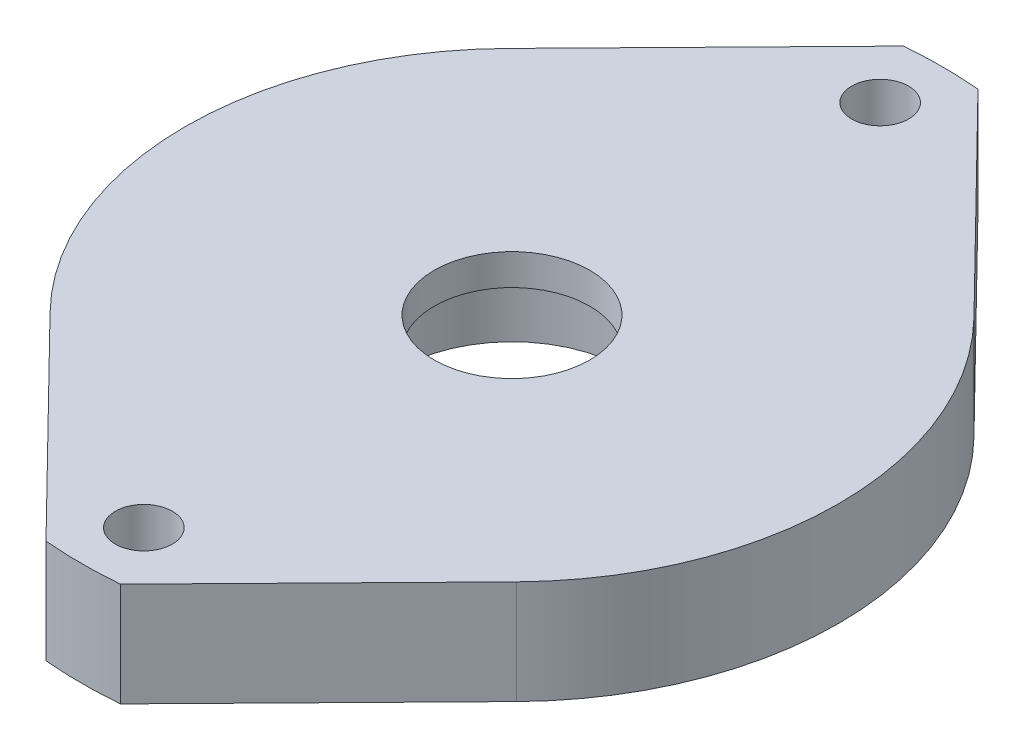
ISO-10303-21;
HEADER;
FILE_DESCRIPTION(('STEP AP214'),'2;1');
FILE_NAME('part.step','',(''),(''),'','','');
FILE_SCHEMA(('AUTOMOTIVE_DESIGN { 1 0 10303 214 1 1 1 1 }'));
ENDSEC;
DATA;
#1=APPLICATION_CONTEXT('core data for automotive mechanical design processes');
#2=APPLICATION_PROTOCOL_DEFINITION('international standard','automotive_design',2000,#1);
#3=PRODUCT_CONTEXT('',#1,'mechanical');
#4=PRODUCT('Part','Part','',(#3));
#5=PRODUCT_RELATED_PRODUCT_CATEGORY('part','',(#4));
#6=PRODUCT_DEFINITION_FORMATION('','',#4);
#7=PRODUCT_DEFINITION_CONTEXT('part definition',#1,'design');
#8=PRODUCT_DEFINITION('design','',#6,#7);
#9=PRODUCT_DEFINITION_SHAPE('','',#8);
#10=(LENGTH_UNIT() NAMED_UNIT(*) SI_UNIT(.MILLI.,.METRE.));
#11=(NAMED_UNIT(*) PLANE_ANGLE_UNIT() SI_UNIT($,.RADIAN.));
#12=(NAMED_UNIT(*) SI_UNIT($,.STERADIAN.) SOLID_ANGLE_UNIT());
#13=UNCERTAINTY_MEASURE_WITH_UNIT(LENGTH_MEASURE(1.E-05),#10,'distance_accuracy_value','');
#14=(GEOMETRIC_REPRESENTATION_CONTEXT(3) GLOBAL_UNCERTAINTY_ASSIGNED_CONTEXT((#13)) GLOBAL_UNIT_ASSIGNED_CONTEXT((#10,
#11,#12)) REPRESENTATION_CONTEXT('',''));
#15=CARTESIAN_POINT('',(0.,0.,0.));
#16=DIRECTION('',(0.,0.,1.));
#17=DIRECTION('',(1.,0.,0.));
#18=AXIS2_PLACEMENT_3D('',#15,#16,#17);
#19=CARTESIAN_POINT('',(0.,0.,0.));
#20=DIRECTION('',(0.,1.,0.));
#21=DIRECTION('',(0.,0.,1.));
#22=AXIS2_PLACEMENT_3D('',#19,#20,#21);
#23=PLANE('',#22);
#24=CARTESIAN_POINT('',(0.,0.,-35.5));
#25=DIRECTION('',(0.,-1.,0.));
#26=DIRECTION('',(0.,0.,-1.));
#27=AXIS2_PLACEMENT_3D('',#24,#25,#26);
#28=CIRCLE('',#27,2.74999999999999);
#29=CARTESIAN_POINT('',(0.,0.,-38.25));
#30=VERTEX_POINT('',#29);
#31=EDGE_CURVE('E237',#30,#30,#28,.T.);
#32=ORIENTED_EDGE('',*,*,#31,.F.);
#33=EDGE_LOOP('',(#32));
#34=FACE_BOUND('',#33,.T.);
#35=CARTESIAN_POINT('',(0.,0.,35.5));
#36=DIRECTION('',(0.,-1.,0.));
#37=DIRECTION('',(0.,0.,-1.));
#38=AXIS2_PLACEMENT_3D('',#35,#36,#37);
#39=CIRCLE('',#38,2.74999999999999);
#40=CARTESIAN_POINT('',(0.,0.,32.75));
#41=VERTEX_POINT('',#40);
#42=EDGE_CURVE('E239',#41,#41,#39,.T.);
#43=ORIENTED_EDGE('',*,*,#42,.F.);
#44=EDGE_LOOP('',(#43));
#45=FACE_BOUND('',#44,.T.);
#46=DIRECTION('',(-0.699854212223765,0.,0.714285714285714));
#47=VECTOR('',#46,1.);
#48=CARTESIAN_POINT('',(22.5,0.,22.0454076850486));
#49=LINE('',#48,#47);
#50=CARTESIAN_POINT('',(22.5,0.,22.0454076850486));
#51=VERTEX_POINT('',#50);
#52=CARTESIAN_POINT('',(3.59098044825795,0.,41.3443449509147));
#53=VERTEX_POINT('',#52);
#54=EDGE_CURVE('E145',#51,#53,#49,.T.);
#55=ORIENTED_EDGE('',*,*,#54,.T.);
#56=CARTESIAN_POINT('',(0.,0.,0.));
#57=DIRECTION('',(0.,1.,0.));
#58=DIRECTION('',(0.,0.,1.));
#59=AXIS2_PLACEMENT_3D('',#56,#57,#58);
#60=CIRCLE('',#59,41.5);
#61=CARTESIAN_POINT('',(-3.59098044825795,0.,41.3443449509147));
#62=VERTEX_POINT('',#61);
#63=EDGE_CURVE('E41',#62,#53,#60,.T.);
#64=ORIENTED_EDGE('',*,*,#63,.F.);
#65=DIRECTION('',(-0.699854212223765,0.,-0.714285714285714));
#66=VECTOR('',#65,1.);
#67=CARTESIAN_POINT('',(-22.5,0.,22.0454076850486));
#68=LINE('',#67,#66);
#69=CARTESIAN_POINT('',(-22.5,0.,22.0454076850486));
#70=VERTEX_POINT('',#69);
#71=EDGE_CURVE('E119',#62,#70,#68,.T.);
#72=ORIENTED_EDGE('',*,*,#71,.T.);
#73=CARTESIAN_POINT('',(0.,0.,0.));
#74=DIRECTION('',(0.,-1.,0.));
#75=DIRECTION('',(0.,0.,-1.));
#76=AXIS2_PLACEMENT_3D('',#73,#74,#75);
#77=CIRCLE('',#76,31.5);
#78=CARTESIAN_POINT('',(-22.5,0.,-22.0454076850486));
#79=VERTEX_POINT('',#78);
#80=EDGE_CURVE('E137',#70,#79,#77,.T.);
#81=ORIENTED_EDGE('',*,*,#80,.T.);
#82=DIRECTION('',(0.699854212223765,0.,-0.714285714285714));
#83=VECTOR('',#82,1.);
#84=CARTESIAN_POINT('',(-22.5,0.,-22.0454076850486));
#85=LINE('',#84,#83);
#86=CARTESIAN_POINT('',(-3.59098044825794,0.,-41.3443449509147));
#87=VERTEX_POINT('',#86);
#88=EDGE_CURVE('E106',#79,#87,#85,.T.);
#89=ORIENTED_EDGE('',*,*,#88,.T.);
#90=CARTESIAN_POINT('',(3.59098044825795,0.,-41.3443449509147));
#91=VERTEX_POINT('',#90);
#92=EDGE_CURVE('E163',#91,#87,#60,.T.);
#93=ORIENTED_EDGE('',*,*,#92,.F.);
#94=DIRECTION('',(0.699854212223765,0.,0.714285714285714));
#95=VECTOR('',#94,1.);
#96=CARTESIAN_POINT('',(22.5,0.,-22.0454076850486));
#97=LINE('',#96,#95);
#98=CARTESIAN_POINT('',(22.5,0.,-22.0454076850486));
#99=VERTEX_POINT('',#98);
#100=EDGE_CURVE('E141',#91,#99,#97,.T.);
#101=ORIENTED_EDGE('',*,*,#100,.T.);
#102=CARTESIAN_POINT('',(0.,0.,0.));
#103=DIRECTION('',(0.,-1.,0.));
#104=DIRECTION('',(0.,0.,-1.));
#105=AXIS2_PLACEMENT_3D('',#102,#103,#104);
#106=CIRCLE('',#105,31.5);
#107=EDGE_CURVE('E53',#99,#51,#106,.T.);
#108=ORIENTED_EDGE('',*,*,#107,.T.);
#109=EDGE_LOOP('',(#55,#64,#72,#81,#89,#93,#101,#108));
#110=FACE_BOUND('',#109,.T.);
#111=CARTESIAN_POINT('',(0.,0.,0.));
#112=DIRECTION('',(0.,1.,0.));
#113=DIRECTION('',(0.,0.,1.));
#114=AXIS2_PLACEMENT_3D('',#111,#112,#113);
#115=CIRCLE('',#114,11.);
#116=CARTESIAN_POINT('',(0.,0.,11.));
#117=VERTEX_POINT('',#116);
#118=EDGE_CURVE('E251',#117,#117,#115,.T.);
#119=ORIENTED_EDGE('',*,*,#118,.T.);
#120=EDGE_LOOP('',(#119));
#121=FACE_BOUND('',#120,.T.);
#122=ADVANCED_FACE('F37',(#34,#45,#110,#121),#23,.F.);
#123=CARTESIAN_POINT('',(0.,10.,0.));
#124=DIRECTION('',(0.,-1.,0.));
#125=DIRECTION('',(0.,0.,-1.));
#126=AXIS2_PLACEMENT_3D('',#123,#124,#125);
#127=CYLINDRICAL_SURFACE('',#126,41.5);
#128=DIRECTION('',(0.,-1.,0.));
#129=VECTOR('',#128,1.);
#130=CARTESIAN_POINT('',(-3.59098044825795,10.,41.3443449509147));
#131=LINE('',#130,#129);
#132=CARTESIAN_POINT('',(-3.59098044825795,10.,41.3443449509147));
#133=VERTEX_POINT('',#132);
#134=EDGE_CURVE('E151',#133,#62,#131,.T.);
#135=ORIENTED_EDGE('',*,*,#134,.T.);
#136=ORIENTED_EDGE('',*,*,#63,.T.);
#137=DIRECTION('',(0.,-1.,0.));
#138=VECTOR('',#137,1.);
#139=CARTESIAN_POINT('',(3.59098044825795,10.,41.3443449509147));
#140=LINE('',#139,#138);
#141=CARTESIAN_POINT('',(3.59098044825795,10.,41.3443449509147));
#142=VERTEX_POINT('',#141);
#143=EDGE_CURVE('E154',#142,#53,#140,.T.);
#144=ORIENTED_EDGE('',*,*,#143,.F.);
#145=CARTESIAN_POINT('',(0.,10.,0.));
#146=DIRECTION('',(0.,1.,0.));
#147=DIRECTION('',(0.,0.,1.));
#148=AXIS2_PLACEMENT_3D('',#145,#146,#147);
#149=CIRCLE('',#148,41.5);
#150=EDGE_CURVE('E46',#133,#142,#149,.T.);
#151=ORIENTED_EDGE('',*,*,#150,.F.);
#152=EDGE_LOOP('',(#135,#136,#144,#151));
#153=FACE_BOUND('',#152,.T.);
#154=ADVANCED_FACE('F39',(#153),#127,.T.);
#155=DIRECTION('',(0.,-1.,0.));
#156=VECTOR('',#155,1.);
#157=CARTESIAN_POINT('',(3.59098044825795,10.,-41.3443449509147));
#158=LINE('',#157,#156);
#159=CARTESIAN_POINT('',(3.59098044825795,10.,-41.3443449509147));
#160=VERTEX_POINT('',#159);
#161=EDGE_CURVE('E160',#160,#91,#158,.T.);
#162=ORIENTED_EDGE('',*,*,#161,.T.);
#163=ORIENTED_EDGE('',*,*,#92,.T.);
#164=DIRECTION('',(0.,-1.,0.));
#165=VECTOR('',#164,1.);
#166=CARTESIAN_POINT('',(-3.59098044825794,10.,-41.3443449509147));
#167=LINE('',#166,#165);
#168=CARTESIAN_POINT('',(-3.59098044825795,10.,-41.3443449509147));
#169=VERTEX_POINT('',#168);
#170=EDGE_CURVE('E61',#169,#87,#167,.T.);
#171=ORIENTED_EDGE('',*,*,#170,.F.);
#172=EDGE_CURVE('E12',#160,#169,#149,.T.);
#173=ORIENTED_EDGE('',*,*,#172,.F.);
#174=EDGE_LOOP('',(#162,#163,#171,#173));
#175=FACE_BOUND('',#174,.T.);
#176=ADVANCED_FACE('F182',(#175),#127,.T.);
#177=CARTESIAN_POINT('',(0.,10.,0.));
#178=DIRECTION('',(0.,1.,0.));
#179=DIRECTION('',(0.,0.,1.));
#180=AXIS2_PLACEMENT_3D('',#177,#178,#179);
#181=PLANE('',#180);
#182=CARTESIAN_POINT('',(0.,10.,-35.5));
#183=DIRECTION('',(0.,-1.,0.));
#184=DIRECTION('',(0.,0.,-1.));
#185=AXIS2_PLACEMENT_3D('',#182,#183,#184);
#186=CIRCLE('',#185,2.75);
#187=CARTESIAN_POINT('',(0.,10.,-38.25));
#188=VERTEX_POINT('',#187);
#189=EDGE_CURVE('E235',#188,#188,#186,.T.);
#190=ORIENTED_EDGE('',*,*,#189,.T.);
#191=EDGE_LOOP('',(#190));
#192=FACE_BOUND('',#191,.T.);
#193=CARTESIAN_POINT('',(0.,10.,35.5));
#194=DIRECTION('',(0.,-1.,0.));
#195=DIRECTION('',(0.,0.,-1.));
#196=AXIS2_PLACEMENT_3D('',#193,#194,#195);
#197=CIRCLE('',#196,2.75);
#198=CARTESIAN_POINT('',(0.,10.,32.75));
#199=VERTEX_POINT('',#198);
#200=EDGE_CURVE('E244',#199,#199,#197,.T.);
#201=ORIENTED_EDGE('',*,*,#200,.T.);
#202=EDGE_LOOP('',(#201));
#203=FACE_BOUND('',#202,.T.);
#204=CARTESIAN_POINT('',(0.,10.,0.));
#205=DIRECTION('',(0.,1.,0.));
#206=DIRECTION('',(0.,0.,1.));
#207=AXIS2_PLACEMENT_3D('',#204,#205,#206);
#208=CIRCLE('',#207,7.5);
#209=CARTESIAN_POINT('',(0.,10.,7.5));
#210=VERTEX_POINT('',#209);
#211=EDGE_CURVE('E247',#210,#210,#208,.F.);
#212=ORIENTED_EDGE('',*,*,#211,.T.);
#213=EDGE_LOOP('',(#212));
#214=FACE_BOUND('',#213,.T.);
#215=ORIENTED_EDGE('',*,*,#150,.T.);
#216=DIRECTION('',(-0.699854212223765,0.,0.714285714285714));
#217=VECTOR('',#216,1.);
#218=CARTESIAN_POINT('',(22.5,10.,22.0454076850486));
#219=LINE('',#218,#217);
#220=CARTESIAN_POINT('',(22.5,10.,22.0454076850486));
#221=VERTEX_POINT('',#220);
#222=EDGE_CURVE('E134',#221,#142,#219,.T.);
#223=ORIENTED_EDGE('',*,*,#222,.F.);
#224=CARTESIAN_POINT('',(0.,10.,0.));
#225=DIRECTION('',(0.,-1.,0.));
#226=DIRECTION('',(0.,0.,-1.));
#227=AXIS2_PLACEMENT_3D('',#224,#225,#226);
#228=CIRCLE('',#227,31.5);
#229=CARTESIAN_POINT('',(22.5,10.,-22.0454076850486));
#230=VERTEX_POINT('',#229);
#231=EDGE_CURVE('E128',#230,#221,#228,.T.);
#232=ORIENTED_EDGE('',*,*,#231,.F.);
#233=DIRECTION('',(0.699854212223765,0.,0.714285714285714));
#234=VECTOR('',#233,1.);
#235=CARTESIAN_POINT('',(22.5,10.,-22.0454076850486));
#236=LINE('',#235,#234);
#237=EDGE_CURVE('E125',#160,#230,#236,.T.);
#238=ORIENTED_EDGE('',*,*,#237,.F.);
#239=ORIENTED_EDGE('',*,*,#172,.T.);
#240=DIRECTION('',(0.699854212223765,0.,-0.714285714285714));
#241=VECTOR('',#240,1.);
#242=CARTESIAN_POINT('',(-22.5,10.,-22.0454076850486));
#243=LINE('',#242,#241);
#244=CARTESIAN_POINT('',(-22.5,10.,-22.0454076850486));
#245=VERTEX_POINT('',#244);
#246=EDGE_CURVE('E105',#245,#169,#243,.T.);
#247=ORIENTED_EDGE('',*,*,#246,.F.);
#248=CARTESIAN_POINT('',(0.,10.,0.));
#249=DIRECTION('',(0.,-1.,0.));
#250=DIRECTION('',(0.,0.,-1.));
#251=AXIS2_PLACEMENT_3D('',#248,#249,#250);
#252=CIRCLE('',#251,31.5);
#253=CARTESIAN_POINT('',(-22.5,10.,22.0454076850486));
#254=VERTEX_POINT('',#253);
#255=EDGE_CURVE('E113',#254,#245,#252,.T.);
#256=ORIENTED_EDGE('',*,*,#255,.F.);
#257=DIRECTION('',(-0.699854212223765,0.,-0.714285714285714));
#258=VECTOR('',#257,1.);
#259=CARTESIAN_POINT('',(-22.5,10.,22.0454076850486));
#260=LINE('',#259,#258);
#261=EDGE_CURVE('E110',#133,#254,#260,.T.);
#262=ORIENTED_EDGE('',*,*,#261,.F.);
#263=EDGE_LOOP('',(#215,#223,#232,#238,#239,#247,#256,#262));
#264=FACE_BOUND('',#263,.T.);
#265=ADVANCED_FACE('F122',(#192,#203,#214,#264),#181,.T.);
#266=CARTESIAN_POINT('',(-22.5,10.,22.0454076850486));
#267=DIRECTION('',(-0.714285714285714,0.,0.699854212223765));
#268=DIRECTION('',(0.699854212223765,0.,0.714285714285714));
#269=AXIS2_PLACEMENT_3D('',#266,#267,#268);
#270=PLANE('',#269);
#271=ORIENTED_EDGE('',*,*,#71,.F.);
#272=ORIENTED_EDGE('',*,*,#134,.F.);
#273=ORIENTED_EDGE('',*,*,#261,.T.);
#274=DIRECTION('',(0.,-1.,0.));
#275=VECTOR('',#274,1.);
#276=CARTESIAN_POINT('',(-22.5,10.,22.0454076850486));
#277=LINE('',#276,#275);
#278=EDGE_CURVE('E115',#254,#70,#277,.T.);
#279=ORIENTED_EDGE('',*,*,#278,.T.);
#280=EDGE_LOOP('',(#271,#272,#273,#279));
#281=FACE_BOUND('',#280,.T.);
#282=ADVANCED_FACE('F188',(#281),#270,.T.);
#283=CARTESIAN_POINT('',(-22.5,10.,-22.0454076850486));
#284=DIRECTION('',(-0.714285714285714,0.,-0.699854212223765));
#285=DIRECTION('',(-0.699854212223765,0.,0.714285714285714));
#286=AXIS2_PLACEMENT_3D('',#283,#284,#285);
#287=PLANE('',#286);
#288=ORIENTED_EDGE('',*,*,#88,.F.);
#289=DIRECTION('',(0.,-1.,0.));
#290=VECTOR('',#289,1.);
#291=CARTESIAN_POINT('',(-22.5,10.,-22.0454076850486));
#292=LINE('',#291,#290);
#293=EDGE_CURVE('E101',#245,#79,#292,.T.);
#294=ORIENTED_EDGE('',*,*,#293,.F.);
#295=ORIENTED_EDGE('',*,*,#246,.T.);
#296=ORIENTED_EDGE('',*,*,#170,.T.);
#297=EDGE_LOOP('',(#288,#294,#295,#296));
#298=FACE_BOUND('',#297,.T.);
#299=ADVANCED_FACE('F103',(#298),#287,.T.);
#300=CARTESIAN_POINT('',(0.,10.,0.));
#301=DIRECTION('',(0.,-1.,0.));
#302=DIRECTION('',(0.,0.,-1.));
#303=AXIS2_PLACEMENT_3D('',#300,#301,#302);
#304=CYLINDRICAL_SURFACE('',#303,31.5);
#305=ORIENTED_EDGE('',*,*,#80,.F.);
#306=ORIENTED_EDGE('',*,*,#278,.F.);
#307=ORIENTED_EDGE('',*,*,#255,.T.);
#308=ORIENTED_EDGE('',*,*,#293,.T.);
#309=EDGE_LOOP('',(#305,#306,#307,#308));
#310=FACE_BOUND('',#309,.T.);
#311=ADVANCED_FACE('F114',(#310),#304,.T.);
#312=CARTESIAN_POINT('',(22.5,10.,22.0454076850486));
#313=DIRECTION('',(0.714285714285714,0.,0.699854212223765));
#314=DIRECTION('',(0.699854212223765,0.,-0.714285714285714));
#315=AXIS2_PLACEMENT_3D('',#312,#313,#314);
#316=PLANE('',#315);
#317=ORIENTED_EDGE('',*,*,#54,.F.);
#318=DIRECTION('',(0.,-1.,0.));
#319=VECTOR('',#318,1.);
#320=CARTESIAN_POINT('',(22.5,10.,22.0454076850486));
#321=LINE('',#320,#319);
#322=EDGE_CURVE('E156',#221,#51,#321,.T.);
#323=ORIENTED_EDGE('',*,*,#322,.F.);
#324=ORIENTED_EDGE('',*,*,#222,.T.);
#325=ORIENTED_EDGE('',*,*,#143,.T.);
#326=EDGE_LOOP('',(#317,#323,#324,#325));
#327=FACE_BOUND('',#326,.T.);
#328=ADVANCED_FACE('F177',(#327),#316,.T.);
#329=CARTESIAN_POINT('',(0.,10.,0.));
#330=DIRECTION('',(0.,-1.,0.));
#331=DIRECTION('',(0.,0.,-1.));
#332=AXIS2_PLACEMENT_3D('',#329,#330,#331);
#333=CYLINDRICAL_SURFACE('',#332,31.5);
#334=ORIENTED_EDGE('',*,*,#107,.F.);
#335=DIRECTION('',(0.,-1.,0.));
#336=VECTOR('',#335,1.);
#337=CARTESIAN_POINT('',(22.5,10.,-22.0454076850486));
#338=LINE('',#337,#336);
#339=EDGE_CURVE('E158',#230,#99,#338,.T.);
#340=ORIENTED_EDGE('',*,*,#339,.F.);
#341=ORIENTED_EDGE('',*,*,#231,.T.);
#342=ORIENTED_EDGE('',*,*,#322,.T.);
#343=EDGE_LOOP('',(#334,#340,#341,#342));
#344=FACE_BOUND('',#343,.T.);
#345=ADVANCED_FACE('F179',(#344),#333,.T.);
#346=CARTESIAN_POINT('',(22.5,10.,-22.0454076850486));
#347=DIRECTION('',(0.714285714285714,0.,-0.699854212223765));
#348=DIRECTION('',(-0.699854212223765,0.,-0.714285714285714));
#349=AXIS2_PLACEMENT_3D('',#346,#347,#348);
#350=PLANE('',#349);
#351=ORIENTED_EDGE('',*,*,#100,.F.);
#352=ORIENTED_EDGE('',*,*,#161,.F.);
#353=ORIENTED_EDGE('',*,*,#237,.T.);
#354=ORIENTED_EDGE('',*,*,#339,.T.);
#355=EDGE_LOOP('',(#351,#352,#353,#354));
#356=FACE_BOUND('',#355,.T.);
#357=ADVANCED_FACE('F181',(#356),#350,.T.);
#358=CARTESIAN_POINT('',(0.,7.,0.));
#359=DIRECTION('',(0.,-1.,0.));
#360=DIRECTION('',(0.,0.,-1.));
#361=AXIS2_PLACEMENT_3D('',#358,#359,#360);
#362=CYLINDRICAL_SURFACE('',#361,11.);
#363=CARTESIAN_POINT('',(0.,7.,0.));
#364=DIRECTION('',(0.,1.,0.));
#365=DIRECTION('',(0.,0.,1.));
#366=AXIS2_PLACEMENT_3D('',#363,#364,#365);
#367=CIRCLE('',#366,11.);
#368=CARTESIAN_POINT('',(0.,7.,11.));
#369=VERTEX_POINT('',#368);
#370=EDGE_CURVE('E139',#369,#369,#367,.T.);
#371=ORIENTED_EDGE('',*,*,#370,.T.);
#372=EDGE_LOOP('',(#371));
#373=FACE_BOUND('',#372,.T.);
#374=ORIENTED_EDGE('',*,*,#118,.F.);
#375=EDGE_LOOP('',(#374));
#376=FACE_BOUND('',#375,.T.);
#377=ADVANCED_FACE('F204',(#373,#376),#362,.F.);
#378=CARTESIAN_POINT('',(0.,7.,0.));
#379=DIRECTION('',(0.,1.,0.));
#380=DIRECTION('',(0.,0.,1.));
#381=AXIS2_PLACEMENT_3D('',#378,#379,#380);
#382=PLANE('',#381);
#383=CARTESIAN_POINT('',(0.,7.,0.));
#384=DIRECTION('',(0.,-1.,0.));
#385=DIRECTION('',(0.,0.,-1.));
#386=AXIS2_PLACEMENT_3D('',#383,#384,#385);
#387=CIRCLE('',#386,7.5);
#388=CARTESIAN_POINT('',(0.,7.,-7.5));
#389=VERTEX_POINT('',#388);
#390=EDGE_CURVE('E248',#389,#389,#387,.T.);
#391=ORIENTED_EDGE('',*,*,#390,.F.);
#392=EDGE_LOOP('',(#391));
#393=FACE_BOUND('',#392,.T.);
#394=ORIENTED_EDGE('',*,*,#370,.F.);
#395=EDGE_LOOP('',(#394));
#396=FACE_BOUND('',#395,.T.);
#397=ADVANCED_FACE('F214',(#393,#396),#382,.F.);
#398=CARTESIAN_POINT('',(0.,10.001,0.));
#399=DIRECTION('',(0.,-1.,0.));
#400=DIRECTION('',(0.,0.,-1.));
#401=AXIS2_PLACEMENT_3D('',#398,#399,#400);
#402=CYLINDRICAL_SURFACE('',#401,7.5);
#403=ORIENTED_EDGE('',*,*,#211,.F.);
#404=EDGE_LOOP('',(#403));
#405=FACE_BOUND('',#404,.T.);
#406=ORIENTED_EDGE('',*,*,#390,.T.);
#407=EDGE_LOOP('',(#406));
#408=FACE_BOUND('',#407,.T.);
#409=ADVANCED_FACE('F218',(#405,#408),#402,.F.);
#410=CARTESIAN_POINT('',(0.,0.,35.5));
#411=DIRECTION('',(0.,-1.,0.));
#412=DIRECTION('',(0.,0.,-1.));
#413=AXIS2_PLACEMENT_3D('',#410,#411,#412);
#414=CYLINDRICAL_SURFACE('',#413,2.74999999999999);
#415=ORIENTED_EDGE('',*,*,#200,.F.);
#416=EDGE_LOOP('',(#415));
#417=FACE_BOUND('',#416,.T.);
#418=ORIENTED_EDGE('',*,*,#42,.T.);
#419=EDGE_LOOP('',(#418));
#420=FACE_BOUND('',#419,.T.);
#421=ADVANCED_FACE('F222',(#417,#420),#414,.F.);
#422=CARTESIAN_POINT('',(0.,0.,-35.5));
#423=DIRECTION('',(0.,-1.,0.));
#424=DIRECTION('',(0.,0.,-1.));
#425=AXIS2_PLACEMENT_3D('',#422,#423,#424);
#426=CYLINDRICAL_SURFACE('',#425,2.74999999999999);
#427=ORIENTED_EDGE('',*,*,#189,.F.);
#428=EDGE_LOOP('',(#427));
#429=FACE_BOUND('',#428,.T.);
#430=ORIENTED_EDGE('',*,*,#31,.T.);
#431=EDGE_LOOP('',(#430));
#432=FACE_BOUND('',#431,.T.);
#433=ADVANCED_FACE('F226',(#429,#432),#426,.F.);
#434=CLOSED_SHELL('',(#122,#154,#176,#265,#282,#299,#311,#328,#345,#357,#377,#397,#409,#421,#433));
#435=MANIFOLD_SOLID_BREP('B2',#434);
#436=ADVANCED_BREP_SHAPE_REPRESENTATION('',(#18,#435),#14);
#437=SHAPE_DEFINITION_REPRESENTATION(#9,#436);
ENDSEC;
END-ISO-10303-21;
